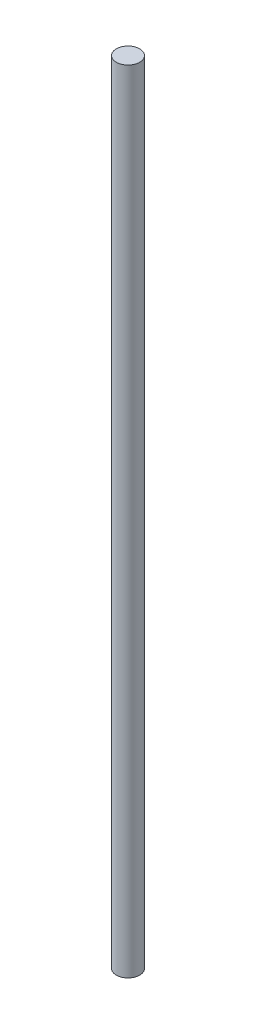
ISO-10303-21;
HEADER;
FILE_DESCRIPTION(('STEP AP214'),'2;1');
FILE_NAME('part.step','',(''),(''),'','','');
FILE_SCHEMA(('AUTOMOTIVE_DESIGN { 1 0 10303 214 1 1 1 1 }'));
ENDSEC;
DATA;
#1=APPLICATION_CONTEXT('core data for automotive mechanical design processes');
#2=APPLICATION_PROTOCOL_DEFINITION('international standard','automotive_design',2000,#1);
#3=PRODUCT_CONTEXT('',#1,'mechanical');
#4=PRODUCT('Part','Part','',(#3));
#5=PRODUCT_RELATED_PRODUCT_CATEGORY('part','',(#4));
#6=PRODUCT_DEFINITION_FORMATION('','',#4);
#7=PRODUCT_DEFINITION_CONTEXT('part definition',#1,'design');
#8=PRODUCT_DEFINITION('design','',#6,#7);
#9=PRODUCT_DEFINITION_SHAPE('','',#8);
#10=(LENGTH_UNIT() NAMED_UNIT(*) SI_UNIT(.MILLI.,.METRE.));
#11=(NAMED_UNIT(*) PLANE_ANGLE_UNIT() SI_UNIT($,.RADIAN.));
#12=(NAMED_UNIT(*) SI_UNIT($,.STERADIAN.) SOLID_ANGLE_UNIT());
#13=UNCERTAINTY_MEASURE_WITH_UNIT(LENGTH_MEASURE(1.E-05),#10,'distance_accuracy_value','');
#14=(GEOMETRIC_REPRESENTATION_CONTEXT(3) GLOBAL_UNCERTAINTY_ASSIGNED_CONTEXT((#13)) GLOBAL_UNIT_ASSIGNED_CONTEXT((#10,
#11,#12)) REPRESENTATION_CONTEXT('',''));
#15=CARTESIAN_POINT('',(0.,0.,0.));
#16=DIRECTION('',(0.,0.,1.));
#17=DIRECTION('',(1.,0.,0.));
#18=AXIS2_PLACEMENT_3D('',#15,#16,#17);
#19=CARTESIAN_POINT('',(4.78104318353406,220.,5.25285665559335));
#20=DIRECTION('',(0.,-1.,0.));
#21=DIRECTION('',(0.,0.,-1.));
#22=AXIS2_PLACEMENT_3D('',#19,#20,#21);
#23=CYLINDRICAL_SURFACE('',#22,3.25);
#24=CARTESIAN_POINT('',(4.78104318353406,220.,5.25285665559335));
#25=DIRECTION('',(0.,1.,0.));
#26=DIRECTION('',(0.,0.,1.));
#27=AXIS2_PLACEMENT_3D('',#24,#25,#26);
#28=CIRCLE('',#27,3.25);
#29=CARTESIAN_POINT('',(4.78104318353406,220.,8.50285665559335));
#30=VERTEX_POINT('',#29);
#31=EDGE_CURVE('E10',#30,#30,#28,.T.);
#32=ORIENTED_EDGE('',*,*,#31,.F.);
#33=EDGE_LOOP('',(#32));
#34=FACE_BOUND('',#33,.T.);
#35=CARTESIAN_POINT('',(4.78104318353406,0.,5.25285665559335));
#36=DIRECTION('',(0.,1.,0.));
#37=DIRECTION('',(0.,0.,1.));
#38=AXIS2_PLACEMENT_3D('',#35,#36,#37);
#39=CIRCLE('',#38,3.25);
#40=CARTESIAN_POINT('',(4.78104318353406,0.,8.50285665559335));
#41=VERTEX_POINT('',#40);
#42=EDGE_CURVE('E38',#41,#41,#39,.T.);
#43=ORIENTED_EDGE('',*,*,#42,.T.);
#44=EDGE_LOOP('',(#43));
#45=FACE_BOUND('',#44,.T.);
#46=ADVANCED_FACE('F35',(#34,#45),#23,.T.);
#47=CARTESIAN_POINT('',(4.78104318353406,220.,5.25285665559335));
#48=DIRECTION('',(0.,1.,0.));
#49=DIRECTION('',(0.,0.,1.));
#50=AXIS2_PLACEMENT_3D('',#47,#48,#49);
#51=PLANE('',#50);
#52=ORIENTED_EDGE('',*,*,#31,.T.);
#53=EDGE_LOOP('',(#52));
#54=FACE_BOUND('',#53,.T.);
#55=ADVANCED_FACE('F50',(#54),#51,.T.);
#56=CARTESIAN_POINT('',(4.78104318353406,0.,5.25285665559335));
#57=DIRECTION('',(0.,1.,0.));
#58=DIRECTION('',(0.,0.,1.));
#59=AXIS2_PLACEMENT_3D('',#56,#57,#58);
#60=PLANE('',#59);
#61=ORIENTED_EDGE('',*,*,#42,.F.);
#62=EDGE_LOOP('',(#61));
#63=FACE_BOUND('',#62,.T.);
#64=ADVANCED_FACE('F48',(#63),#60,.F.);
#65=CLOSED_SHELL('',(#46,#55,#64));
#66=MANIFOLD_SOLID_BREP('B2',#65);
#67=ADVANCED_BREP_SHAPE_REPRESENTATION('',(#18,#66),#14);
#68=SHAPE_DEFINITION_REPRESENTATION(#9,#67);
ENDSEC;
END-ISO-10303-21;
